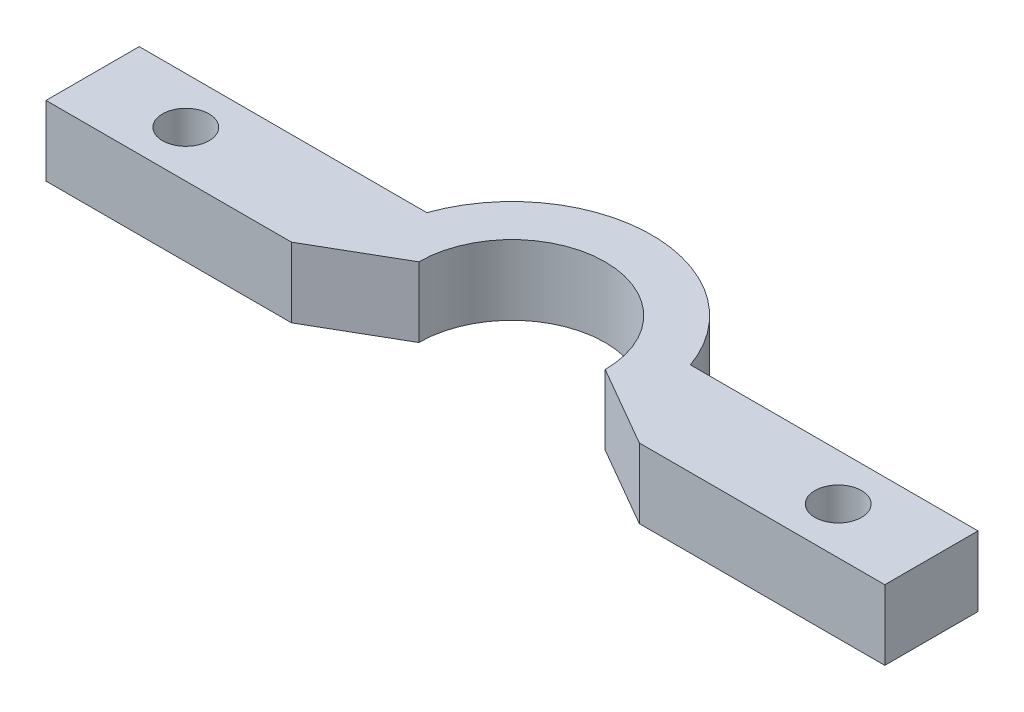
ISO-10303-21;
HEADER;
FILE_DESCRIPTION(('STEP AP214'),'2;1');
FILE_NAME('part.step','',(''),(''),'','','');
FILE_SCHEMA(('AUTOMOTIVE_DESIGN { 1 0 10303 214 1 1 1 1 }'));
ENDSEC;
DATA;
#1=APPLICATION_CONTEXT('core data for automotive mechanical design processes');
#2=APPLICATION_PROTOCOL_DEFINITION('international standard','automotive_design',2000,#1);
#3=PRODUCT_CONTEXT('',#1,'mechanical');
#4=PRODUCT('Part','Part','',(#3));
#5=PRODUCT_RELATED_PRODUCT_CATEGORY('part','',(#4));
#6=PRODUCT_DEFINITION_FORMATION('','',#4);
#7=PRODUCT_DEFINITION_CONTEXT('part definition',#1,'design');
#8=PRODUCT_DEFINITION('design','',#6,#7);
#9=PRODUCT_DEFINITION_SHAPE('','',#8);
#10=(LENGTH_UNIT() NAMED_UNIT(*) SI_UNIT(.MILLI.,.METRE.));
#11=(NAMED_UNIT(*) PLANE_ANGLE_UNIT() SI_UNIT($,.RADIAN.));
#12=(NAMED_UNIT(*) SI_UNIT($,.STERADIAN.) SOLID_ANGLE_UNIT());
#13=UNCERTAINTY_MEASURE_WITH_UNIT(LENGTH_MEASURE(1.E-05),#10,'distance_accuracy_value','');
#14=(GEOMETRIC_REPRESENTATION_CONTEXT(3) GLOBAL_UNCERTAINTY_ASSIGNED_CONTEXT((#13)) GLOBAL_UNIT_ASSIGNED_CONTEXT((#10,
#11,#12)) REPRESENTATION_CONTEXT('',''));
#15=CARTESIAN_POINT('',(0.,0.,0.));
#16=DIRECTION('',(0.,0.,1.));
#17=DIRECTION('',(1.,0.,0.));
#18=AXIS2_PLACEMENT_3D('',#15,#16,#17);
#19=CARTESIAN_POINT('',(-0.793750000000001,1.190625,-1.3748153285078));
#20=DIRECTION('',(0.5,0.,0.866025403784439));
#21=DIRECTION('',(0.866025403784438,0.,-0.5));
#22=AXIS2_PLACEMENT_3D('',#19,#20,#21);
#23=PLANE('',#22);
#24=DIRECTION('',(-0.866025403784439,0.,0.5));
#25=VECTOR('',#24,1.);
#26=CARTESIAN_POINT('',(-0.793750000000001,-1.190625,-1.3748153285078));
#27=LINE('',#26,#25);
#28=CARTESIAN_POINT('',(-3.175,-1.190625,0.));
#29=VERTEX_POINT('',#28);
#30=CARTESIAN_POINT('',(-5.9246306570156,-1.190625,1.5875));
#31=VERTEX_POINT('',#30);
#32=EDGE_CURVE('E148',#29,#31,#27,.T.);
#33=ORIENTED_EDGE('',*,*,#32,.F.);
#34=DIRECTION('',(0.,-1.,0.));
#35=VECTOR('',#34,1.);
#36=CARTESIAN_POINT('',(-3.175,1.190625,0.));
#37=LINE('',#36,#35);
#38=CARTESIAN_POINT('',(-3.175,1.190625,0.));
#39=VERTEX_POINT('',#38);
#40=EDGE_CURVE('E11',#39,#29,#37,.T.);
#41=ORIENTED_EDGE('',*,*,#40,.F.);
#42=DIRECTION('',(-0.866025403784439,0.,0.5));
#43=VECTOR('',#42,1.);
#44=CARTESIAN_POINT('',(-0.793750000000001,1.190625,-1.3748153285078));
#45=LINE('',#44,#43);
#46=CARTESIAN_POINT('',(-5.9246306570156,1.190625,1.5875));
#47=VERTEX_POINT('',#46);
#48=EDGE_CURVE('E214',#39,#47,#45,.T.);
#49=ORIENTED_EDGE('',*,*,#48,.T.);
#50=DIRECTION('',(0.,-1.,0.));
#51=VECTOR('',#50,1.);
#52=CARTESIAN_POINT('',(-5.9246306570156,1.190625,1.5875));
#53=LINE('',#52,#51);
#54=EDGE_CURVE('E92',#47,#31,#53,.T.);
#55=ORIENTED_EDGE('',*,*,#54,.T.);
#56=EDGE_LOOP('',(#33,#41,#49,#55));
#57=FACE_BOUND('',#56,.T.);
#58=ADVANCED_FACE('F35',(#57),#23,.T.);
#59=CARTESIAN_POINT('',(0.,1.190625,0.));
#60=DIRECTION('',(0.,-1.,0.));
#61=DIRECTION('',(0.,0.,-1.));
#62=AXIS2_PLACEMENT_3D('',#59,#60,#61);
#63=CYLINDRICAL_SURFACE('',#62,3.175);
#64=CARTESIAN_POINT('',(0.,-1.190625,0.));
#65=DIRECTION('',(0.,1.,0.));
#66=DIRECTION('',(0.,0.,1.));
#67=AXIS2_PLACEMENT_3D('',#64,#65,#66);
#68=CIRCLE('',#67,3.175);
#69=CARTESIAN_POINT('',(3.175,-1.190625,0.));
#70=VERTEX_POINT('',#69);
#71=EDGE_CURVE('E151',#70,#29,#68,.T.);
#72=ORIENTED_EDGE('',*,*,#71,.F.);
#73=DIRECTION('',(0.,-1.,0.));
#74=VECTOR('',#73,1.);
#75=CARTESIAN_POINT('',(3.175,1.190625,0.));
#76=LINE('',#75,#74);
#77=CARTESIAN_POINT('',(3.175,1.190625,0.));
#78=VERTEX_POINT('',#77);
#79=EDGE_CURVE('E44',#78,#70,#76,.T.);
#80=ORIENTED_EDGE('',*,*,#79,.F.);
#81=CARTESIAN_POINT('',(0.,1.190625,0.));
#82=DIRECTION('',(0.,1.,0.));
#83=DIRECTION('',(0.,0.,1.));
#84=AXIS2_PLACEMENT_3D('',#81,#82,#83);
#85=CIRCLE('',#84,3.175);
#86=EDGE_CURVE('E212',#78,#39,#85,.T.);
#87=ORIENTED_EDGE('',*,*,#86,.T.);
#88=ORIENTED_EDGE('',*,*,#40,.T.);
#89=EDGE_LOOP('',(#72,#80,#87,#88));
#90=FACE_BOUND('',#89,.T.);
#91=ADVANCED_FACE('F199',(#90),#63,.F.);
#92=CARTESIAN_POINT('',(0.793750000000001,1.190625,-1.3748153285078));
#93=DIRECTION('',(-0.5,0.,0.866025403784439));
#94=DIRECTION('',(0.866025403784438,0.,0.5));
#95=AXIS2_PLACEMENT_3D('',#92,#93,#94);
#96=PLANE('',#95);
#97=DIRECTION('',(-0.866025403784439,0.,-0.5));
#98=VECTOR('',#97,1.);
#99=CARTESIAN_POINT('',(0.793750000000001,-1.190625,-1.3748153285078));
#100=LINE('',#99,#98);
#101=CARTESIAN_POINT('',(5.92463065701559,-1.190625,1.5875));
#102=VERTEX_POINT('',#101);
#103=EDGE_CURVE('E154',#102,#70,#100,.T.);
#104=ORIENTED_EDGE('',*,*,#103,.F.);
#105=DIRECTION('',(0.,-1.,0.));
#106=VECTOR('',#105,1.);
#107=CARTESIAN_POINT('',(5.92463065701559,1.190625,1.5875));
#108=LINE('',#107,#106);
#109=CARTESIAN_POINT('',(5.92463065701559,1.190625,1.5875));
#110=VERTEX_POINT('',#109);
#111=EDGE_CURVE('E188',#110,#102,#108,.T.);
#112=ORIENTED_EDGE('',*,*,#111,.F.);
#113=DIRECTION('',(-0.866025403784439,0.,-0.5));
#114=VECTOR('',#113,1.);
#115=CARTESIAN_POINT('',(0.793750000000001,1.190625,-1.3748153285078));
#116=LINE('',#115,#114);
#117=EDGE_CURVE('E195',#110,#78,#116,.T.);
#118=ORIENTED_EDGE('',*,*,#117,.T.);
#119=ORIENTED_EDGE('',*,*,#79,.T.);
#120=EDGE_LOOP('',(#104,#112,#118,#119));
#121=FACE_BOUND('',#120,.T.);
#122=ADVANCED_FACE('F193',(#121),#96,.T.);
#123=CARTESIAN_POINT('',(0.,1.190625,1.5875));
#124=DIRECTION('',(0.,0.,-1.));
#125=DIRECTION('',(-1.,0.,0.));
#126=AXIS2_PLACEMENT_3D('',#123,#124,#125);
#127=PLANE('',#126);
#128=DIRECTION('',(1.,0.,0.));
#129=VECTOR('',#128,1.);
#130=CARTESIAN_POINT('',(0.,-1.190625,1.5875));
#131=LINE('',#130,#129);
#132=CARTESIAN_POINT('',(14.2875,-1.190625,1.5875));
#133=VERTEX_POINT('',#132);
#134=EDGE_CURVE('E157',#102,#133,#131,.T.);
#135=ORIENTED_EDGE('',*,*,#134,.T.);
#136=DIRECTION('',(0.,-1.,0.));
#137=VECTOR('',#136,1.);
#138=CARTESIAN_POINT('',(14.2875,1.190625,1.5875));
#139=LINE('',#138,#137);
#140=CARTESIAN_POINT('',(14.2875,1.190625,1.5875));
#141=VERTEX_POINT('',#140);
#142=EDGE_CURVE('E185',#141,#133,#139,.T.);
#143=ORIENTED_EDGE('',*,*,#142,.F.);
#144=DIRECTION('',(1.,0.,0.));
#145=VECTOR('',#144,1.);
#146=CARTESIAN_POINT('',(0.,1.190625,1.5875));
#147=LINE('',#146,#145);
#148=EDGE_CURVE('E209',#110,#141,#147,.T.);
#149=ORIENTED_EDGE('',*,*,#148,.F.);
#150=ORIENTED_EDGE('',*,*,#111,.T.);
#151=EDGE_LOOP('',(#135,#143,#149,#150));
#152=FACE_BOUND('',#151,.T.);
#153=ADVANCED_FACE('F206',(#152),#127,.F.);
#154=CARTESIAN_POINT('',(14.2875,1.190625,0.));
#155=DIRECTION('',(-1.,0.,0.));
#156=DIRECTION('',(0.,0.,1.));
#157=AXIS2_PLACEMENT_3D('',#154,#155,#156);
#158=PLANE('',#157);
#159=DIRECTION('',(0.,0.,-1.));
#160=VECTOR('',#159,1.);
#161=CARTESIAN_POINT('',(14.2875,-1.190625,0.));
#162=LINE('',#161,#160);
#163=CARTESIAN_POINT('',(14.2875,-1.190625,-1.5875));
#164=VERTEX_POINT('',#163);
#165=EDGE_CURVE('E160',#133,#164,#162,.T.);
#166=ORIENTED_EDGE('',*,*,#165,.T.);
#167=DIRECTION('',(0.,-1.,0.));
#168=VECTOR('',#167,1.);
#169=CARTESIAN_POINT('',(14.2875,1.190625,-1.5875));
#170=LINE('',#169,#168);
#171=CARTESIAN_POINT('',(14.2875,1.190625,-1.5875));
#172=VERTEX_POINT('',#171);
#173=EDGE_CURVE('E183',#172,#164,#170,.T.);
#174=ORIENTED_EDGE('',*,*,#173,.F.);
#175=DIRECTION('',(0.,0.,-1.));
#176=VECTOR('',#175,1.);
#177=CARTESIAN_POINT('',(14.2875,1.190625,0.));
#178=LINE('',#177,#176);
#179=EDGE_CURVE('E210',#141,#172,#178,.T.);
#180=ORIENTED_EDGE('',*,*,#179,.F.);
#181=ORIENTED_EDGE('',*,*,#142,.T.);
#182=EDGE_LOOP('',(#166,#174,#180,#181));
#183=FACE_BOUND('',#182,.T.);
#184=ADVANCED_FACE('F226',(#183),#158,.F.);
#185=CARTESIAN_POINT('',(0.,1.190625,-1.5875));
#186=DIRECTION('',(0.,0.,-1.));
#187=DIRECTION('',(-1.,0.,0.));
#188=AXIS2_PLACEMENT_3D('',#185,#186,#187);
#189=PLANE('',#188);
#190=DIRECTION('',(1.,0.,0.));
#191=VECTOR('',#190,1.);
#192=CARTESIAN_POINT('',(0.,-1.190625,-1.5875));
#193=LINE('',#192,#191);
#194=CARTESIAN_POINT('',(4.49012806053458,-1.190625,-1.5875));
#195=VERTEX_POINT('',#194);
#196=EDGE_CURVE('E163',#195,#164,#193,.T.);
#197=ORIENTED_EDGE('',*,*,#196,.F.);
#198=DIRECTION('',(0.,-1.,0.));
#199=VECTOR('',#198,1.);
#200=CARTESIAN_POINT('',(4.49012806053458,1.190625,-1.5875));
#201=LINE('',#200,#199);
#202=CARTESIAN_POINT('',(4.49012806053458,1.190625,-1.5875));
#203=VERTEX_POINT('',#202);
#204=EDGE_CURVE('E181',#203,#195,#201,.T.);
#205=ORIENTED_EDGE('',*,*,#204,.F.);
#206=DIRECTION('',(1.,0.,0.));
#207=VECTOR('',#206,1.);
#208=CARTESIAN_POINT('',(0.,1.190625,-1.5875));
#209=LINE('',#208,#207);
#210=EDGE_CURVE('E219',#203,#172,#209,.T.);
#211=ORIENTED_EDGE('',*,*,#210,.T.);
#212=ORIENTED_EDGE('',*,*,#173,.T.);
#213=EDGE_LOOP('',(#197,#205,#211,#212));
#214=FACE_BOUND('',#213,.T.);
#215=ADVANCED_FACE('F223',(#214),#189,.T.);
#216=CARTESIAN_POINT('',(0.,1.190625,0.));
#217=DIRECTION('',(0.,-1.,0.));
#218=DIRECTION('',(0.,0.,-1.));
#219=AXIS2_PLACEMENT_3D('',#216,#217,#218);
#220=CYLINDRICAL_SURFACE('',#219,4.7625);
#221=CARTESIAN_POINT('',(0.,-1.190625,0.));
#222=DIRECTION('',(0.,1.,0.));
#223=DIRECTION('',(0.,0.,1.));
#224=AXIS2_PLACEMENT_3D('',#221,#222,#223);
#225=CIRCLE('',#224,4.7625);
#226=CARTESIAN_POINT('',(-4.49012806053458,-1.190625,-1.5875));
#227=VERTEX_POINT('',#226);
#228=EDGE_CURVE('E166',#195,#227,#225,.T.);
#229=ORIENTED_EDGE('',*,*,#228,.T.);
#230=DIRECTION('',(0.,-1.,0.));
#231=VECTOR('',#230,1.);
#232=CARTESIAN_POINT('',(-4.49012806053458,1.190625,-1.5875));
#233=LINE('',#232,#231);
#234=CARTESIAN_POINT('',(-4.49012806053458,1.190625,-1.5875));
#235=VERTEX_POINT('',#234);
#236=EDGE_CURVE('E127',#235,#227,#233,.T.);
#237=ORIENTED_EDGE('',*,*,#236,.F.);
#238=CARTESIAN_POINT('',(0.,1.190625,0.));
#239=DIRECTION('',(0.,1.,0.));
#240=DIRECTION('',(0.,0.,1.));
#241=AXIS2_PLACEMENT_3D('',#238,#239,#240);
#242=CIRCLE('',#241,4.7625);
#243=EDGE_CURVE('E134',#203,#235,#242,.T.);
#244=ORIENTED_EDGE('',*,*,#243,.F.);
#245=ORIENTED_EDGE('',*,*,#204,.T.);
#246=EDGE_LOOP('',(#229,#237,#244,#245));
#247=FACE_BOUND('',#246,.T.);
#248=ADVANCED_FACE('F229',(#247),#220,.T.);
#249=CARTESIAN_POINT('',(0.,1.190625,-1.5875));
#250=DIRECTION('',(0.,0.,-1.));
#251=DIRECTION('',(-1.,0.,0.));
#252=AXIS2_PLACEMENT_3D('',#249,#250,#251);
#253=PLANE('',#252);
#254=DIRECTION('',(1.,0.,0.));
#255=VECTOR('',#254,1.);
#256=CARTESIAN_POINT('',(0.,-1.190625,-1.5875));
#257=LINE('',#256,#255);
#258=CARTESIAN_POINT('',(-14.2875,-1.190625,-1.5875));
#259=VERTEX_POINT('',#258);
#260=EDGE_CURVE('E122',#259,#227,#257,.T.);
#261=ORIENTED_EDGE('',*,*,#260,.F.);
#262=DIRECTION('',(0.,-1.,0.));
#263=VECTOR('',#262,1.);
#264=CARTESIAN_POINT('',(-14.2875,1.190625,-1.5875));
#265=LINE('',#264,#263);
#266=CARTESIAN_POINT('',(-14.2875,1.190625,-1.5875));
#267=VERTEX_POINT('',#266);
#268=EDGE_CURVE('E117',#267,#259,#265,.T.);
#269=ORIENTED_EDGE('',*,*,#268,.F.);
#270=DIRECTION('',(1.,0.,0.));
#271=VECTOR('',#270,1.);
#272=CARTESIAN_POINT('',(0.,1.190625,-1.5875));
#273=LINE('',#272,#271);
#274=EDGE_CURVE('E120',#267,#235,#273,.T.);
#275=ORIENTED_EDGE('',*,*,#274,.T.);
#276=ORIENTED_EDGE('',*,*,#236,.T.);
#277=EDGE_LOOP('',(#261,#269,#275,#276));
#278=FACE_BOUND('',#277,.T.);
#279=ADVANCED_FACE('F119',(#278),#253,.T.);
#280=CARTESIAN_POINT('',(-14.2875,1.190625,0.));
#281=DIRECTION('',(-1.,0.,0.));
#282=DIRECTION('',(0.,0.,1.));
#283=AXIS2_PLACEMENT_3D('',#280,#281,#282);
#284=PLANE('',#283);
#285=DIRECTION('',(0.,0.,-1.));
#286=VECTOR('',#285,1.);
#287=CARTESIAN_POINT('',(-14.2875,-1.190625,0.));
#288=LINE('',#287,#286);
#289=CARTESIAN_POINT('',(-14.2875,-1.190625,1.5875));
#290=VERTEX_POINT('',#289);
#291=EDGE_CURVE('E170',#290,#259,#288,.T.);
#292=ORIENTED_EDGE('',*,*,#291,.F.);
#293=DIRECTION('',(0.,-1.,0.));
#294=VECTOR('',#293,1.);
#295=CARTESIAN_POINT('',(-14.2875,1.190625,1.5875));
#296=LINE('',#295,#294);
#297=CARTESIAN_POINT('',(-14.2875,1.190625,1.5875));
#298=VERTEX_POINT('',#297);
#299=EDGE_CURVE('E85',#298,#290,#296,.T.);
#300=ORIENTED_EDGE('',*,*,#299,.F.);
#301=DIRECTION('',(0.,0.,-1.));
#302=VECTOR('',#301,1.);
#303=CARTESIAN_POINT('',(-14.2875,1.190625,0.));
#304=LINE('',#303,#302);
#305=EDGE_CURVE('E131',#298,#267,#304,.T.);
#306=ORIENTED_EDGE('',*,*,#305,.T.);
#307=ORIENTED_EDGE('',*,*,#268,.T.);
#308=EDGE_LOOP('',(#292,#300,#306,#307));
#309=FACE_BOUND('',#308,.T.);
#310=ADVANCED_FACE('F137',(#309),#284,.T.);
#311=CARTESIAN_POINT('',(0.,1.190625,1.5875));
#312=DIRECTION('',(0.,0.,-1.));
#313=DIRECTION('',(-1.,0.,0.));
#314=AXIS2_PLACEMENT_3D('',#311,#312,#313);
#315=PLANE('',#314);
#316=DIRECTION('',(1.,0.,0.));
#317=VECTOR('',#316,1.);
#318=CARTESIAN_POINT('',(0.,-1.190625,1.5875));
#319=LINE('',#318,#317);
#320=EDGE_CURVE('E172',#290,#31,#319,.T.);
#321=ORIENTED_EDGE('',*,*,#320,.T.);
#322=ORIENTED_EDGE('',*,*,#54,.F.);
#323=DIRECTION('',(1.,0.,0.));
#324=VECTOR('',#323,1.);
#325=CARTESIAN_POINT('',(0.,1.190625,1.5875));
#326=LINE('',#325,#324);
#327=EDGE_CURVE('E52',#298,#47,#326,.T.);
#328=ORIENTED_EDGE('',*,*,#327,.F.);
#329=ORIENTED_EDGE('',*,*,#299,.T.);
#330=EDGE_LOOP('',(#321,#322,#328,#329));
#331=FACE_BOUND('',#330,.T.);
#332=ADVANCED_FACE('F276',(#331),#315,.F.);
#333=CARTESIAN_POINT('',(-11.1125,1.190625,0.));
#334=DIRECTION('',(0.,-1.,0.));
#335=DIRECTION('',(0.,0.,-1.));
#336=AXIS2_PLACEMENT_3D('',#333,#334,#335);
#337=CYLINDRICAL_SURFACE('',#336,0.793749999999999);
#338=CARTESIAN_POINT('',(-11.1125,1.190625,0.));
#339=DIRECTION('',(0.,1.,0.));
#340=DIRECTION('',(0.,0.,1.));
#341=AXIS2_PLACEMENT_3D('',#338,#339,#340);
#342=CIRCLE('',#341,0.793749999999999);
#343=CARTESIAN_POINT('',(-11.1125,1.190625,-0.793749999999999));
#344=VERTEX_POINT('',#343);
#345=EDGE_CURVE('E177',#344,#344,#342,.T.);
#346=CARTESIAN_POINT('',(-11.1125,-1.190625,0.));
#347=DIRECTION('',(0.,1.,0.));
#348=DIRECTION('',(0.,0.,1.));
#349=AXIS2_PLACEMENT_3D('',#346,#347,#348);
#350=CIRCLE('',#349,0.793749999999999);
#351=CARTESIAN_POINT('',(-11.1125,-1.190625,-0.793749999999999));
#352=VERTEX_POINT('',#351);
#353=EDGE_CURVE('E145',#352,#352,#350,.T.);
#354=CARTESIAN_POINT('',(-11.1125,1.190625,-0.793749999999999));
#355=CARTESIAN_POINT('',(-11.1125,1.1658203125,-0.793749999999999));
#356=CARTESIAN_POINT('',(-11.1125,1.141015625,-0.793749999999999));
#357=CARTESIAN_POINT('',(-11.1125,1.09140625,-0.793749999999999));
#358=CARTESIAN_POINT('',(-11.1125,1.0666015625,-0.793749999999999));
#359=CARTESIAN_POINT('',(-11.1125,1.0169921875,-0.793749999999999));
#360=CARTESIAN_POINT('',(-11.1125,0.9921875,-0.793749999999999));
#361=CARTESIAN_POINT('',(-11.1125,0.942578125,-0.793749999999999));
#362=CARTESIAN_POINT('',(-11.1125,0.9177734375,-0.793749999999999));
#363=CARTESIAN_POINT('',(-11.1125,0.8681640625,-0.793749999999999));
#364=CARTESIAN_POINT('',(-11.1125,0.843359375,-0.793749999999999));
#365=CARTESIAN_POINT('',(-11.1125,0.79375,-0.793749999999999));
#366=CARTESIAN_POINT('',(-11.1125,0.7689453125,-0.793749999999999));
#367=CARTESIAN_POINT('',(-11.1125,0.7193359375,-0.793749999999999));
#368=CARTESIAN_POINT('',(-11.1125,0.69453125,-0.793749999999999));
#369=CARTESIAN_POINT('',(-11.1125,0.644921875,-0.793749999999999));
#370=CARTESIAN_POINT('',(-11.1125,0.6201171875,-0.793749999999999));
#371=CARTESIAN_POINT('',(-11.1125,0.5705078125,-0.793749999999999));
#372=CARTESIAN_POINT('',(-11.1125,0.545703125,-0.793749999999999));
#373=CARTESIAN_POINT('',(-11.1125,0.49609375,-0.793749999999999));
#374=CARTESIAN_POINT('',(-11.1125,0.4712890625,-0.793749999999999));
#375=CARTESIAN_POINT('',(-11.1125,0.4216796875,-0.793749999999999));
#376=CARTESIAN_POINT('',(-11.1125,0.396875,-0.793749999999999));
#377=CARTESIAN_POINT('',(-11.1125,0.347265625,-0.793749999999999));
#378=CARTESIAN_POINT('',(-11.1125,0.3224609375,-0.793749999999999));
#379=CARTESIAN_POINT('',(-11.1125,0.2728515625,-0.793749999999999));
#380=CARTESIAN_POINT('',(-11.1125,0.248046875,-0.793749999999999));
#381=CARTESIAN_POINT('',(-11.1125,0.1984375,-0.793749999999999));
#382=CARTESIAN_POINT('',(-11.1125,0.1736328125,-0.793749999999999));
#383=CARTESIAN_POINT('',(-11.1125,0.1240234375,-0.793749999999999));
#384=CARTESIAN_POINT('',(-11.1125,0.0992187500000001,-0.793749999999999));
#385=CARTESIAN_POINT('',(-11.1125,0.049609375,-0.793749999999999));
#386=CARTESIAN_POINT('',(-11.1125,0.0248046875,-0.793749999999999));
#387=CARTESIAN_POINT('',(-11.1125,-0.0248046875,-0.793749999999999));
#388=CARTESIAN_POINT('',(-11.1125,-0.049609375,-0.793749999999999));
#389=CARTESIAN_POINT('',(-11.1125,-0.0992187500000001,-0.793749999999999));
#390=CARTESIAN_POINT('',(-11.1125,-0.1240234375,-0.793749999999999));
#391=CARTESIAN_POINT('',(-11.1125,-0.1736328125,-0.793749999999999));
#392=CARTESIAN_POINT('',(-11.1125,-0.1984375,-0.793749999999999));
#393=CARTESIAN_POINT('',(-11.1125,-0.248046875,-0.793749999999999));
#394=CARTESIAN_POINT('',(-11.1125,-0.2728515625,-0.793749999999999));
#395=CARTESIAN_POINT('',(-11.1125,-0.3224609375,-0.793749999999999));
#396=CARTESIAN_POINT('',(-11.1125,-0.347265625,-0.793749999999999));
#397=CARTESIAN_POINT('',(-11.1125,-0.396875,-0.793749999999999));
#398=CARTESIAN_POINT('',(-11.1125,-0.4216796875,-0.793749999999999));
#399=CARTESIAN_POINT('',(-11.1125,-0.4712890625,-0.793749999999999));
#400=CARTESIAN_POINT('',(-11.1125,-0.49609375,-0.793749999999999));
#401=CARTESIAN_POINT('',(-11.1125,-0.545703125,-0.793749999999999));
#402=CARTESIAN_POINT('',(-11.1125,-0.5705078125,-0.793749999999999));
#403=CARTESIAN_POINT('',(-11.1125,-0.6201171875,-0.793749999999999));
#404=CARTESIAN_POINT('',(-11.1125,-0.644921875,-0.793749999999999));
#405=CARTESIAN_POINT('',(-11.1125,-0.69453125,-0.793749999999999));
#406=CARTESIAN_POINT('',(-11.1125,-0.7193359375,-0.793749999999999));
#407=CARTESIAN_POINT('',(-11.1125,-0.7689453125,-0.793749999999999));
#408=CARTESIAN_POINT('',(-11.1125,-0.79375,-0.793749999999999));
#409=CARTESIAN_POINT('',(-11.1125,-0.843359375,-0.793749999999999));
#410=CARTESIAN_POINT('',(-11.1125,-0.8681640625,-0.793749999999999));
#411=CARTESIAN_POINT('',(-11.1125,-0.9177734375,-0.793749999999999));
#412=CARTESIAN_POINT('',(-11.1125,-0.942578125,-0.793749999999999));
#413=CARTESIAN_POINT('',(-11.1125,-0.9921875,-0.793749999999999));
#414=CARTESIAN_POINT('',(-11.1125,-1.0169921875,-0.793749999999999));
#415=CARTESIAN_POINT('',(-11.1125,-1.0666015625,-0.793749999999999));
#416=CARTESIAN_POINT('',(-11.1125,-1.09140625,-0.793749999999999));
#417=CARTESIAN_POINT('',(-11.1125,-1.141015625,-0.793749999999999));
#418=CARTESIAN_POINT('',(-11.1125,-1.1658203125,-0.793749999999999));
#419=CARTESIAN_POINT('',(-11.1125,-1.190625,-0.793749999999999));
#420=B_SPLINE_CURVE_WITH_KNOTS('',3,(#354,#355,#356,#357,#358,#359,#360,#361,#362,#363,#364,
#365,#366,#367,#368,#369,#370,#371,#372,#373,#374,#375,#376,#377,#378,#379,#380,#381,#382,#383,
#384,#385,#386,#387,#388,#389,#390,#391,#392,#393,#394,#395,#396,#397,#398,#399,#400,#401,#402,
#403,#404,#405,#406,#407,#408,#409,#410,#411,#412,#413,#414,#415,#416,#417,#418,#419),
.UNSPECIFIED.,.F.,.F.,(4,2,2,2,2,2,2,2,2,2,2,2,2,2,2,2,2,2,2,2,2,2,2,2,2,2,2,2,2,2,2,2,4),(0.,
0.0744140625,0.148828125,0.2232421875,0.29765625,0.3720703125,0.446484375,0.5208984375,
0.5953125,0.6697265625,0.744140625,0.8185546875,0.89296875,0.9673828125,1.041796875,
1.1162109375,1.190625,1.2650390625,1.339453125,1.4138671875,1.48828125,1.5626953125,1.637109375,
1.7115234375,1.7859375,1.8603515625,1.934765625,2.0091796875,2.08359375,2.1580078125,
2.232421875,2.3068359375,2.38125),.UNSPECIFIED.);
#421=EDGE_CURVE('BSEAM37',#344,#352,#420,.T.);
#422=ORIENTED_EDGE('',*,*,#345,.T.);
#423=ORIENTED_EDGE('',*,*,#353,.F.);
#424=ORIENTED_EDGE('',*,*,#421,.T.);
#425=ORIENTED_EDGE('',*,*,#421,.F.);
#426=EDGE_LOOP('',(#422,#424,#423,#425));
#427=FACE_BOUND('',#426,.T.);
#428=ADVANCED_FACE('F37',(#427),#337,.F.);
#429=CARTESIAN_POINT('',(11.1125,1.190625,0.));
#430=DIRECTION('',(0.,-1.,0.));
#431=DIRECTION('',(0.,0.,-1.));
#432=AXIS2_PLACEMENT_3D('',#429,#430,#431);
#433=CYLINDRICAL_SURFACE('',#432,0.793749999999999);
#434=CARTESIAN_POINT('',(11.1125,1.190625,0.));
#435=DIRECTION('',(0.,1.,0.));
#436=DIRECTION('',(0.,0.,1.));
#437=AXIS2_PLACEMENT_3D('',#434,#435,#436);
#438=CIRCLE('',#437,0.793749999999999);
#439=CARTESIAN_POINT('',(11.1125,1.190625,-0.793749999999999));
#440=VERTEX_POINT('',#439);
#441=EDGE_CURVE('E139',#440,#440,#438,.T.);
#442=CARTESIAN_POINT('',(11.1125,-1.190625,0.));
#443=DIRECTION('',(0.,1.,0.));
#444=DIRECTION('',(0.,0.,1.));
#445=AXIS2_PLACEMENT_3D('',#442,#443,#444);
#446=CIRCLE('',#445,0.793749999999999);
#447=CARTESIAN_POINT('',(11.1125,-1.190625,-0.793749999999999));
#448=VERTEX_POINT('',#447);
#449=EDGE_CURVE('E174',#448,#448,#446,.T.);
#450=CARTESIAN_POINT('',(11.1125,1.190625,-0.793749999999999));
#451=CARTESIAN_POINT('',(11.1125,1.1658203125,-0.793749999999999));
#452=CARTESIAN_POINT('',(11.1125,1.141015625,-0.793749999999999));
#453=CARTESIAN_POINT('',(11.1125,1.09140625,-0.793749999999999));
#454=CARTESIAN_POINT('',(11.1125,1.0666015625,-0.793749999999999));
#455=CARTESIAN_POINT('',(11.1125,1.0169921875,-0.793749999999999));
#456=CARTESIAN_POINT('',(11.1125,0.9921875,-0.793749999999999));
#457=CARTESIAN_POINT('',(11.1125,0.942578125,-0.793749999999999));
#458=CARTESIAN_POINT('',(11.1125,0.9177734375,-0.793749999999999));
#459=CARTESIAN_POINT('',(11.1125,0.8681640625,-0.793749999999999));
#460=CARTESIAN_POINT('',(11.1125,0.843359375,-0.793749999999999));
#461=CARTESIAN_POINT('',(11.1125,0.79375,-0.793749999999999));
#462=CARTESIAN_POINT('',(11.1125,0.7689453125,-0.793749999999999));
#463=CARTESIAN_POINT('',(11.1125,0.7193359375,-0.793749999999999));
#464=CARTESIAN_POINT('',(11.1125,0.69453125,-0.793749999999999));
#465=CARTESIAN_POINT('',(11.1125,0.644921875,-0.793749999999999));
#466=CARTESIAN_POINT('',(11.1125,0.6201171875,-0.793749999999999));
#467=CARTESIAN_POINT('',(11.1125,0.5705078125,-0.793749999999999));
#468=CARTESIAN_POINT('',(11.1125,0.545703125,-0.793749999999999));
#469=CARTESIAN_POINT('',(11.1125,0.49609375,-0.793749999999999));
#470=CARTESIAN_POINT('',(11.1125,0.4712890625,-0.793749999999999));
#471=CARTESIAN_POINT('',(11.1125,0.4216796875,-0.793749999999999));
#472=CARTESIAN_POINT('',(11.1125,0.396875,-0.793749999999999));
#473=CARTESIAN_POINT('',(11.1125,0.347265625,-0.793749999999999));
#474=CARTESIAN_POINT('',(11.1125,0.3224609375,-0.793749999999999));
#475=CARTESIAN_POINT('',(11.1125,0.2728515625,-0.793749999999999));
#476=CARTESIAN_POINT('',(11.1125,0.248046875,-0.793749999999999));
#477=CARTESIAN_POINT('',(11.1125,0.1984375,-0.793749999999999));
#478=CARTESIAN_POINT('',(11.1125,0.1736328125,-0.793749999999999));
#479=CARTESIAN_POINT('',(11.1125,0.1240234375,-0.793749999999999));
#480=CARTESIAN_POINT('',(11.1125,0.0992187500000001,-0.793749999999999));
#481=CARTESIAN_POINT('',(11.1125,0.049609375,-0.793749999999999));
#482=CARTESIAN_POINT('',(11.1125,0.0248046875,-0.793749999999999));
#483=CARTESIAN_POINT('',(11.1125,-0.0248046875,-0.793749999999999));
#484=CARTESIAN_POINT('',(11.1125,-0.049609375,-0.793749999999999));
#485=CARTESIAN_POINT('',(11.1125,-0.0992187500000001,-0.793749999999999));
#486=CARTESIAN_POINT('',(11.1125,-0.1240234375,-0.793749999999999));
#487=CARTESIAN_POINT('',(11.1125,-0.1736328125,-0.793749999999999));
#488=CARTESIAN_POINT('',(11.1125,-0.1984375,-0.793749999999999));
#489=CARTESIAN_POINT('',(11.1125,-0.248046875,-0.793749999999999));
#490=CARTESIAN_POINT('',(11.1125,-0.2728515625,-0.793749999999999));
#491=CARTESIAN_POINT('',(11.1125,-0.3224609375,-0.793749999999999));
#492=CARTESIAN_POINT('',(11.1125,-0.347265625,-0.793749999999999));
#493=CARTESIAN_POINT('',(11.1125,-0.396875,-0.793749999999999));
#494=CARTESIAN_POINT('',(11.1125,-0.4216796875,-0.793749999999999));
#495=CARTESIAN_POINT('',(11.1125,-0.4712890625,-0.793749999999999));
#496=CARTESIAN_POINT('',(11.1125,-0.49609375,-0.793749999999999));
#497=CARTESIAN_POINT('',(11.1125,-0.545703125,-0.793749999999999));
#498=CARTESIAN_POINT('',(11.1125,-0.5705078125,-0.793749999999999));
#499=CARTESIAN_POINT('',(11.1125,-0.6201171875,-0.793749999999999));
#500=CARTESIAN_POINT('',(11.1125,-0.644921875,-0.793749999999999));
#501=CARTESIAN_POINT('',(11.1125,-0.69453125,-0.793749999999999));
#502=CARTESIAN_POINT('',(11.1125,-0.7193359375,-0.793749999999999));
#503=CARTESIAN_POINT('',(11.1125,-0.7689453125,-0.793749999999999));
#504=CARTESIAN_POINT('',(11.1125,-0.79375,-0.793749999999999));
#505=CARTESIAN_POINT('',(11.1125,-0.843359375,-0.793749999999999));
#506=CARTESIAN_POINT('',(11.1125,-0.8681640625,-0.793749999999999));
#507=CARTESIAN_POINT('',(11.1125,-0.9177734375,-0.793749999999999));
#508=CARTESIAN_POINT('',(11.1125,-0.942578125,-0.793749999999999));
#509=CARTESIAN_POINT('',(11.1125,-0.9921875,-0.793749999999999));
#510=CARTESIAN_POINT('',(11.1125,-1.0169921875,-0.793749999999999));
#511=CARTESIAN_POINT('',(11.1125,-1.0666015625,-0.793749999999999));
#512=CARTESIAN_POINT('',(11.1125,-1.09140625,-0.793749999999999));
#513=CARTESIAN_POINT('',(11.1125,-1.141015625,-0.793749999999999));
#514=CARTESIAN_POINT('',(11.1125,-1.1658203125,-0.793749999999999));
#515=CARTESIAN_POINT('',(11.1125,-1.190625,-0.793749999999999));
#516=B_SPLINE_CURVE_WITH_KNOTS('',3,(#450,#451,#452,#453,#454,#455,#456,#457,#458,#459,#460,
#461,#462,#463,#464,#465,#466,#467,#468,#469,#470,#471,#472,#473,#474,#475,#476,#477,#478,#479,
#480,#481,#482,#483,#484,#485,#486,#487,#488,#489,#490,#491,#492,#493,#494,#495,#496,#497,#498,
#499,#500,#501,#502,#503,#504,#505,#506,#507,#508,#509,#510,#511,#512,#513,#514,#515),
.UNSPECIFIED.,.F.,.F.,(4,2,2,2,2,2,2,2,2,2,2,2,2,2,2,2,2,2,2,2,2,2,2,2,2,2,2,2,2,2,2,2,4),(0.,
0.0744140625,0.148828125,0.2232421875,0.29765625,0.3720703125,0.446484375,0.5208984375,
0.5953125,0.6697265625,0.744140625,0.8185546875,0.89296875,0.9673828125,1.041796875,
1.1162109375,1.190625,1.2650390625,1.339453125,1.4138671875,1.48828125,1.5626953125,1.637109375,
1.7115234375,1.7859375,1.8603515625,1.934765625,2.0091796875,2.08359375,2.1580078125,
2.232421875,2.3068359375,2.38125),.UNSPECIFIED.);
#517=EDGE_CURVE('BSEAM293',#440,#448,#516,.T.);
#518=ORIENTED_EDGE('',*,*,#441,.T.);
#519=ORIENTED_EDGE('',*,*,#449,.F.);
#520=ORIENTED_EDGE('',*,*,#517,.T.);
#521=ORIENTED_EDGE('',*,*,#517,.F.);
#522=EDGE_LOOP('',(#518,#520,#519,#521));
#523=FACE_BOUND('',#522,.T.);
#524=ADVANCED_FACE('F293',(#523),#433,.F.);
#525=CARTESIAN_POINT('',(0.,1.190625,0.));
#526=DIRECTION('',(0.,1.,0.));
#527=DIRECTION('',(0.,0.,1.));
#528=AXIS2_PLACEMENT_3D('',#525,#526,#527);
#529=PLANE('',#528);
#530=ORIENTED_EDGE('',*,*,#345,.F.);
#531=EDGE_LOOP('',(#530));
#532=FACE_BOUND('',#531,.T.);
#533=ORIENTED_EDGE('',*,*,#48,.F.);
#534=ORIENTED_EDGE('',*,*,#86,.F.);
#535=ORIENTED_EDGE('',*,*,#117,.F.);
#536=ORIENTED_EDGE('',*,*,#148,.T.);
#537=ORIENTED_EDGE('',*,*,#179,.T.);
#538=ORIENTED_EDGE('',*,*,#210,.F.);
#539=ORIENTED_EDGE('',*,*,#243,.T.);
#540=ORIENTED_EDGE('',*,*,#274,.F.);
#541=ORIENTED_EDGE('',*,*,#305,.F.);
#542=ORIENTED_EDGE('',*,*,#327,.T.);
#543=EDGE_LOOP('',(#533,#534,#535,#536,#537,#538,#539,#540,#541,#542));
#544=FACE_BOUND('',#543,.T.);
#545=ORIENTED_EDGE('',*,*,#441,.F.);
#546=EDGE_LOOP('',(#545));
#547=FACE_BOUND('',#546,.T.);
#548=ADVANCED_FACE('F129',(#532,#544,#547),#529,.T.);
#549=CARTESIAN_POINT('',(0.,-1.190625,0.));
#550=DIRECTION('',(0.,1.,0.));
#551=DIRECTION('',(0.,0.,1.));
#552=AXIS2_PLACEMENT_3D('',#549,#550,#551);
#553=PLANE('',#552);
#554=ORIENTED_EDGE('',*,*,#353,.T.);
#555=EDGE_LOOP('',(#554));
#556=FACE_BOUND('',#555,.T.);
#557=ORIENTED_EDGE('',*,*,#32,.T.);
#558=ORIENTED_EDGE('',*,*,#320,.F.);
#559=ORIENTED_EDGE('',*,*,#291,.T.);
#560=ORIENTED_EDGE('',*,*,#260,.T.);
#561=ORIENTED_EDGE('',*,*,#228,.F.);
#562=ORIENTED_EDGE('',*,*,#196,.T.);
#563=ORIENTED_EDGE('',*,*,#165,.F.);
#564=ORIENTED_EDGE('',*,*,#134,.F.);
#565=ORIENTED_EDGE('',*,*,#103,.T.);
#566=ORIENTED_EDGE('',*,*,#71,.T.);
#567=EDGE_LOOP('',(#557,#558,#559,#560,#561,#562,#563,#564,#565,#566));
#568=FACE_BOUND('',#567,.T.);
#569=ORIENTED_EDGE('',*,*,#449,.T.);
#570=EDGE_LOOP('',(#569));
#571=FACE_BOUND('',#570,.T.);
#572=ADVANCED_FACE('F202',(#556,#568,#571),#553,.F.);
#573=CLOSED_SHELL('',(#58,#91,#122,#153,#184,#215,#248,#279,#310,#332,#428,#524,#548,#572));
#574=MANIFOLD_SOLID_BREP('B2',#573);
#575=ADVANCED_BREP_SHAPE_REPRESENTATION('',(#18,#574),#14);
#576=SHAPE_DEFINITION_REPRESENTATION(#9,#575);
ENDSEC;
END-ISO-10303-21;
